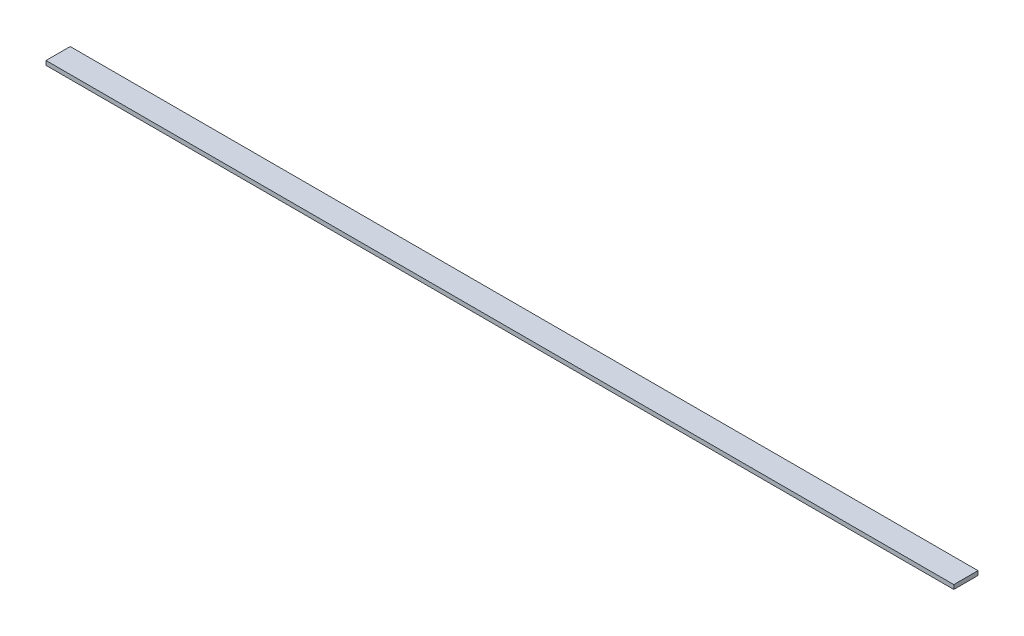
ISO-10303-21;
HEADER;
FILE_DESCRIPTION(('STEP AP214'),'2;1');
FILE_NAME('part.step','',(''),(''),'','','');
FILE_SCHEMA(('AUTOMOTIVE_DESIGN { 1 0 10303 214 1 1 1 1 }'));
ENDSEC;
DATA;
#1=APPLICATION_CONTEXT('core data for automotive mechanical design processes');
#2=APPLICATION_PROTOCOL_DEFINITION('international standard','automotive_design',2000,#1);
#3=PRODUCT_CONTEXT('',#1,'mechanical');
#4=PRODUCT('Part','Part','',(#3));
#5=PRODUCT_RELATED_PRODUCT_CATEGORY('part','',(#4));
#6=PRODUCT_DEFINITION_FORMATION('','',#4);
#7=PRODUCT_DEFINITION_CONTEXT('part definition',#1,'design');
#8=PRODUCT_DEFINITION('design','',#6,#7);
#9=PRODUCT_DEFINITION_SHAPE('','',#8);
#10=(LENGTH_UNIT() NAMED_UNIT(*) SI_UNIT(.MILLI.,.METRE.));
#11=(NAMED_UNIT(*) PLANE_ANGLE_UNIT() SI_UNIT($,.RADIAN.));
#12=(NAMED_UNIT(*) SI_UNIT($,.STERADIAN.) SOLID_ANGLE_UNIT());
#13=UNCERTAINTY_MEASURE_WITH_UNIT(LENGTH_MEASURE(1.E-05),#10,'distance_accuracy_value','');
#14=(GEOMETRIC_REPRESENTATION_CONTEXT(3) GLOBAL_UNCERTAINTY_ASSIGNED_CONTEXT((#13)) GLOBAL_UNIT_ASSIGNED_CONTEXT((#10,
#11,#12)) REPRESENTATION_CONTEXT('',''));
#15=CARTESIAN_POINT('',(0.,0.,0.));
#16=DIRECTION('',(0.,0.,1.));
#17=DIRECTION('',(1.,0.,0.));
#18=AXIS2_PLACEMENT_3D('',#15,#16,#17);
#19=CARTESIAN_POINT('',(-750.,7.,-20.));
#20=DIRECTION('',(1.,0.,0.));
#21=DIRECTION('',(0.,0.,-1.));
#22=AXIS2_PLACEMENT_3D('',#19,#20,#21);
#23=PLANE('',#22);
#24=DIRECTION('',(0.,0.,1.));
#25=VECTOR('',#24,1.);
#26=CARTESIAN_POINT('',(-750.,0.,-20.));
#27=LINE('',#26,#25);
#28=CARTESIAN_POINT('',(-750.,0.,-20.));
#29=VERTEX_POINT('',#28);
#30=CARTESIAN_POINT('',(-750.,0.,20.));
#31=VERTEX_POINT('',#30);
#32=EDGE_CURVE('E113',#29,#31,#27,.T.);
#33=ORIENTED_EDGE('',*,*,#32,.T.);
#34=DIRECTION('',(0.,-1.,0.));
#35=VECTOR('',#34,1.);
#36=CARTESIAN_POINT('',(-750.,7.,20.));
#37=LINE('',#36,#35);
#38=CARTESIAN_POINT('',(-750.,7.,20.));
#39=VERTEX_POINT('',#38);
#40=EDGE_CURVE('E11',#39,#31,#37,.T.);
#41=ORIENTED_EDGE('',*,*,#40,.F.);
#42=DIRECTION('',(0.,0.,1.));
#43=VECTOR('',#42,1.);
#44=CARTESIAN_POINT('',(-750.,7.,-20.));
#45=LINE('',#44,#43);
#46=CARTESIAN_POINT('',(-750.,7.,-20.));
#47=VERTEX_POINT('',#46);
#48=EDGE_CURVE('E96',#47,#39,#45,.T.);
#49=ORIENTED_EDGE('',*,*,#48,.F.);
#50=DIRECTION('',(0.,-1.,0.));
#51=VECTOR('',#50,1.);
#52=CARTESIAN_POINT('',(-750.,7.,-20.));
#53=LINE('',#52,#51);
#54=EDGE_CURVE('E109',#47,#29,#53,.T.);
#55=ORIENTED_EDGE('',*,*,#54,.T.);
#56=EDGE_LOOP('',(#33,#41,#49,#55));
#57=FACE_BOUND('',#56,.T.);
#58=ADVANCED_FACE('F41',(#57),#23,.F.);
#59=CARTESIAN_POINT('',(-750.,7.,20.));
#60=DIRECTION('',(0.,0.,-1.));
#61=DIRECTION('',(-1.,0.,0.));
#62=AXIS2_PLACEMENT_3D('',#59,#60,#61);
#63=PLANE('',#62);
#64=DIRECTION('',(1.,0.,0.));
#65=VECTOR('',#64,1.);
#66=CARTESIAN_POINT('',(-750.,0.,20.));
#67=LINE('',#66,#65);
#68=CARTESIAN_POINT('',(750.,0.,19.9999999999998));
#69=VERTEX_POINT('',#68);
#70=EDGE_CURVE('E101',#31,#69,#67,.T.);
#71=ORIENTED_EDGE('',*,*,#70,.T.);
#72=DIRECTION('',(0.,-1.,0.));
#73=VECTOR('',#72,1.);
#74=CARTESIAN_POINT('',(750.,7.,19.9999999999998));
#75=LINE('',#74,#73);
#76=CARTESIAN_POINT('',(750.,7.,19.9999999999998));
#77=VERTEX_POINT('',#76);
#78=EDGE_CURVE('E49',#77,#69,#75,.T.);
#79=ORIENTED_EDGE('',*,*,#78,.F.);
#80=DIRECTION('',(1.,0.,0.));
#81=VECTOR('',#80,1.);
#82=CARTESIAN_POINT('',(-750.,7.,20.));
#83=LINE('',#82,#81);
#84=EDGE_CURVE('E91',#39,#77,#83,.T.);
#85=ORIENTED_EDGE('',*,*,#84,.F.);
#86=ORIENTED_EDGE('',*,*,#40,.T.);
#87=EDGE_LOOP('',(#71,#79,#85,#86));
#88=FACE_BOUND('',#87,.T.);
#89=ADVANCED_FACE('F100',(#88),#63,.F.);
#90=CARTESIAN_POINT('',(750.,7.,-20.0000000000002));
#91=DIRECTION('',(-1.,0.,0.));
#92=DIRECTION('',(0.,0.,1.));
#93=AXIS2_PLACEMENT_3D('',#90,#91,#92);
#94=PLANE('',#93);
#95=DIRECTION('',(0.,0.,-1.));
#96=VECTOR('',#95,1.);
#97=CARTESIAN_POINT('',(750.,0.,-20.0000000000002));
#98=LINE('',#97,#96);
#99=CARTESIAN_POINT('',(750.,0.,-20.0000000000002));
#100=VERTEX_POINT('',#99);
#101=EDGE_CURVE('E78',#69,#100,#98,.T.);
#102=ORIENTED_EDGE('',*,*,#101,.T.);
#103=DIRECTION('',(0.,-1.,0.));
#104=VECTOR('',#103,1.);
#105=CARTESIAN_POINT('',(750.,7.,-20.0000000000002));
#106=LINE('',#105,#104);
#107=CARTESIAN_POINT('',(750.,7.,-20.0000000000002));
#108=VERTEX_POINT('',#107);
#109=EDGE_CURVE('E103',#108,#100,#106,.T.);
#110=ORIENTED_EDGE('',*,*,#109,.F.);
#111=DIRECTION('',(0.,0.,-1.));
#112=VECTOR('',#111,1.);
#113=CARTESIAN_POINT('',(750.,7.,-20.0000000000002));
#114=LINE('',#113,#112);
#115=EDGE_CURVE('E94',#77,#108,#114,.T.);
#116=ORIENTED_EDGE('',*,*,#115,.F.);
#117=ORIENTED_EDGE('',*,*,#78,.T.);
#118=EDGE_LOOP('',(#102,#110,#116,#117));
#119=FACE_BOUND('',#118,.T.);
#120=ADVANCED_FACE('F104',(#119),#94,.F.);
#121=CARTESIAN_POINT('',(-750.,7.,-20.));
#122=DIRECTION('',(0.,0.,1.));
#123=DIRECTION('',(1.,0.,0.));
#124=AXIS2_PLACEMENT_3D('',#121,#122,#123);
#125=PLANE('',#124);
#126=DIRECTION('',(-1.,0.,0.));
#127=VECTOR('',#126,1.);
#128=CARTESIAN_POINT('',(-750.,0.,-20.));
#129=LINE('',#128,#127);
#130=EDGE_CURVE('E84',#100,#29,#129,.T.);
#131=ORIENTED_EDGE('',*,*,#130,.T.);
#132=ORIENTED_EDGE('',*,*,#54,.F.);
#133=DIRECTION('',(-1.,0.,0.));
#134=VECTOR('',#133,1.);
#135=CARTESIAN_POINT('',(-750.,7.,-20.));
#136=LINE('',#135,#134);
#137=EDGE_CURVE('E57',#108,#47,#136,.T.);
#138=ORIENTED_EDGE('',*,*,#137,.F.);
#139=ORIENTED_EDGE('',*,*,#109,.T.);
#140=EDGE_LOOP('',(#131,#132,#138,#139));
#141=FACE_BOUND('',#140,.T.);
#142=ADVANCED_FACE('F123',(#141),#125,.F.);
#143=CARTESIAN_POINT('',(0.,7.,0.));
#144=DIRECTION('',(0.,1.,0.));
#145=DIRECTION('',(0.,0.,1.));
#146=AXIS2_PLACEMENT_3D('',#143,#144,#145);
#147=PLANE('',#146);
#148=ORIENTED_EDGE('',*,*,#48,.T.);
#149=ORIENTED_EDGE('',*,*,#84,.T.);
#150=ORIENTED_EDGE('',*,*,#115,.T.);
#151=ORIENTED_EDGE('',*,*,#137,.T.);
#152=EDGE_LOOP('',(#148,#149,#150,#151));
#153=FACE_BOUND('',#152,.T.);
#154=ADVANCED_FACE('F92',(#153),#147,.T.);
#155=CARTESIAN_POINT('',(0.,0.,0.));
#156=DIRECTION('',(0.,1.,0.));
#157=DIRECTION('',(0.,0.,1.));
#158=AXIS2_PLACEMENT_3D('',#155,#156,#157);
#159=PLANE('',#158);
#160=ORIENTED_EDGE('',*,*,#32,.F.);
#161=ORIENTED_EDGE('',*,*,#130,.F.);
#162=ORIENTED_EDGE('',*,*,#101,.F.);
#163=ORIENTED_EDGE('',*,*,#70,.F.);
#164=EDGE_LOOP('',(#160,#161,#162,#163));
#165=FACE_BOUND('',#164,.T.);
#166=ADVANCED_FACE('F126',(#165),#159,.F.);
#167=CLOSED_SHELL('',(#58,#89,#120,#142,#154,#166));
#168=MANIFOLD_SOLID_BREP('B2',#167);
#169=ADVANCED_BREP_SHAPE_REPRESENTATION('',(#18,#168),#14);
#170=SHAPE_DEFINITION_REPRESENTATION(#9,#169);
ENDSEC;
END-ISO-10303-21;
